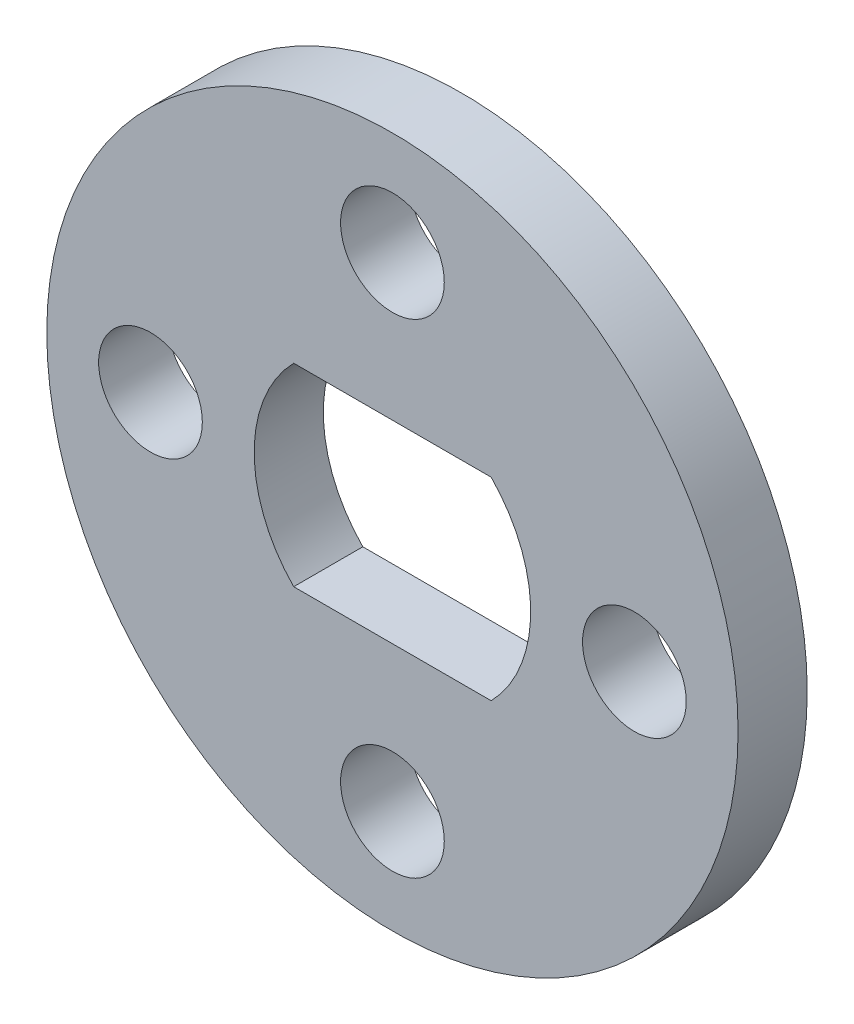
ISO-10303-21;
HEADER;
FILE_DESCRIPTION(('STEP AP214'),'2;1');
FILE_NAME('part.step','',(''),(''),'','','');
FILE_SCHEMA(('AUTOMOTIVE_DESIGN { 1 0 10303 214 1 1 1 1 }'));
ENDSEC;
DATA;
#1=APPLICATION_CONTEXT('core data for automotive mechanical design processes');
#2=APPLICATION_PROTOCOL_DEFINITION('international standard','automotive_design',2000,#1);
#3=PRODUCT_CONTEXT('',#1,'mechanical');
#4=PRODUCT('Part','Part','',(#3));
#5=PRODUCT_RELATED_PRODUCT_CATEGORY('part','',(#4));
#6=PRODUCT_DEFINITION_FORMATION('','',#4);
#7=PRODUCT_DEFINITION_CONTEXT('part definition',#1,'design');
#8=PRODUCT_DEFINITION('design','',#6,#7);
#9=PRODUCT_DEFINITION_SHAPE('','',#8);
#10=(LENGTH_UNIT() NAMED_UNIT(*) SI_UNIT(.MILLI.,.METRE.));
#11=(NAMED_UNIT(*) PLANE_ANGLE_UNIT() SI_UNIT($,.RADIAN.));
#12=(NAMED_UNIT(*) SI_UNIT($,.STERADIAN.) SOLID_ANGLE_UNIT());
#13=UNCERTAINTY_MEASURE_WITH_UNIT(LENGTH_MEASURE(1.E-05),#10,'distance_accuracy_value','');
#14=(GEOMETRIC_REPRESENTATION_CONTEXT(3) GLOBAL_UNCERTAINTY_ASSIGNED_CONTEXT((#13)) GLOBAL_UNIT_ASSIGNED_CONTEXT((#10,
#11,#12)) REPRESENTATION_CONTEXT('',''));
#15=CARTESIAN_POINT('',(0.,0.,0.));
#16=DIRECTION('',(0.,0.,1.));
#17=DIRECTION('',(1.,0.,0.));
#18=AXIS2_PLACEMENT_3D('',#15,#16,#17);
#19=CARTESIAN_POINT('',(0.,0.,2.));
#20=DIRECTION('',(0.,0.,1.));
#21=DIRECTION('',(1.,0.,0.));
#22=AXIS2_PLACEMENT_3D('',#19,#20,#21);
#23=PLANE('',#22);
#24=CARTESIAN_POINT('',(-7.,0.,2.));
#25=DIRECTION('',(0.,0.,1.));
#26=DIRECTION('',(1.,0.,0.));
#27=AXIS2_PLACEMENT_3D('',#24,#25,#26);
#28=CIRCLE('',#27,1.5);
#29=CARTESIAN_POINT('',(-5.5,0.,2.));
#30=VERTEX_POINT('',#29);
#31=EDGE_CURVE('E144',#30,#30,#28,.T.);
#32=ORIENTED_EDGE('',*,*,#31,.F.);
#33=EDGE_LOOP('',(#32));
#34=FACE_BOUND('',#33,.T.);
#35=CARTESIAN_POINT('',(0.,7.,2.));
#36=DIRECTION('',(0.,0.,1.));
#37=DIRECTION('',(1.,0.,0.));
#38=AXIS2_PLACEMENT_3D('',#35,#36,#37);
#39=CIRCLE('',#38,1.5);
#40=CARTESIAN_POINT('',(1.5,7.,2.));
#41=VERTEX_POINT('',#40);
#42=EDGE_CURVE('E160',#41,#41,#39,.T.);
#43=ORIENTED_EDGE('',*,*,#42,.F.);
#44=EDGE_LOOP('',(#43));
#45=FACE_BOUND('',#44,.T.);
#46=CARTESIAN_POINT('',(0.,0.,2.));
#47=DIRECTION('',(0.,0.,1.));
#48=DIRECTION('',(1.,0.,0.));
#49=AXIS2_PLACEMENT_3D('',#46,#47,#48);
#50=CIRCLE('',#49,10.);
#51=CARTESIAN_POINT('',(10.,0.,2.));
#52=VERTEX_POINT('',#51);
#53=EDGE_CURVE('E11',#52,#52,#50,.T.);
#54=ORIENTED_EDGE('',*,*,#53,.T.);
#55=EDGE_LOOP('',(#54));
#56=FACE_BOUND('',#55,.T.);
#57=CARTESIAN_POINT('',(7.,0.,2.));
#58=DIRECTION('',(0.,0.,1.));
#59=DIRECTION('',(1.,0.,0.));
#60=AXIS2_PLACEMENT_3D('',#57,#58,#59);
#61=CIRCLE('',#60,1.5);
#62=CARTESIAN_POINT('',(8.5,0.,2.));
#63=VERTEX_POINT('',#62);
#64=EDGE_CURVE('E152',#63,#63,#61,.T.);
#65=ORIENTED_EDGE('',*,*,#64,.F.);
#66=EDGE_LOOP('',(#65));
#67=FACE_BOUND('',#66,.T.);
#68=CARTESIAN_POINT('',(0.,-7.,2.));
#69=DIRECTION('',(0.,0.,1.));
#70=DIRECTION('',(1.,0.,0.));
#71=AXIS2_PLACEMENT_3D('',#68,#69,#70);
#72=CIRCLE('',#71,1.5);
#73=CARTESIAN_POINT('',(1.5,-7.,2.));
#74=VERTEX_POINT('',#73);
#75=EDGE_CURVE('E136',#74,#74,#72,.T.);
#76=ORIENTED_EDGE('',*,*,#75,.F.);
#77=EDGE_LOOP('',(#76));
#78=FACE_BOUND('',#77,.T.);
#79=DIRECTION('',(-1.,0.,0.));
#80=VECTOR('',#79,1.);
#81=CARTESIAN_POINT('',(0.,-2.8,2.));
#82=LINE('',#81,#80);
#83=CARTESIAN_POINT('',(2.85657137141714,-2.8,2.));
#84=VERTEX_POINT('',#83);
#85=CARTESIAN_POINT('',(-2.85657137141714,-2.8,2.));
#86=VERTEX_POINT('',#85);
#87=EDGE_CURVE('E103',#84,#86,#82,.T.);
#88=ORIENTED_EDGE('',*,*,#87,.T.);
#89=CARTESIAN_POINT('',(0.,0.,2.));
#90=DIRECTION('',(0.,0.,-1.));
#91=DIRECTION('',(-1.,0.,0.));
#92=AXIS2_PLACEMENT_3D('',#89,#90,#91);
#93=CIRCLE('',#92,4.);
#94=CARTESIAN_POINT('',(-2.85657137141714,2.8,2.));
#95=VERTEX_POINT('',#94);
#96=EDGE_CURVE('E98',#95,#86,#93,.F.);
#97=ORIENTED_EDGE('',*,*,#96,.F.);
#98=DIRECTION('',(-1.,0.,0.));
#99=VECTOR('',#98,1.);
#100=CARTESIAN_POINT('',(0.,2.8,2.));
#101=LINE('',#100,#99);
#102=CARTESIAN_POINT('',(2.85657137141714,2.8,2.));
#103=VERTEX_POINT('',#102);
#104=EDGE_CURVE('E89',#103,#95,#101,.T.);
#105=ORIENTED_EDGE('',*,*,#104,.F.);
#106=CARTESIAN_POINT('',(0.,0.,2.));
#107=DIRECTION('',(0.,0.,-1.));
#108=DIRECTION('',(-1.,0.,0.));
#109=AXIS2_PLACEMENT_3D('',#106,#107,#108);
#110=CIRCLE('',#109,4.);
#111=EDGE_CURVE('E63',#103,#84,#110,.T.);
#112=ORIENTED_EDGE('',*,*,#111,.T.);
#113=EDGE_LOOP('',(#88,#97,#105,#112));
#114=FACE_BOUND('',#113,.T.);
#115=ADVANCED_FACE('F47',(#34,#45,#56,#67,#78,#114),#23,.T.);
#116=CARTESIAN_POINT('',(0.,0.,0.));
#117=DIRECTION('',(0.,0.,1.));
#118=DIRECTION('',(1.,0.,0.));
#119=AXIS2_PLACEMENT_3D('',#116,#117,#118);
#120=PLANE('',#119);
#121=CARTESIAN_POINT('',(0.,-7.,0.));
#122=DIRECTION('',(0.,0.,1.));
#123=DIRECTION('',(1.,0.,0.));
#124=AXIS2_PLACEMENT_3D('',#121,#122,#123);
#125=CIRCLE('',#124,1.5);
#126=CARTESIAN_POINT('',(1.5,-7.,0.));
#127=VERTEX_POINT('',#126);
#128=EDGE_CURVE('E130',#127,#127,#125,.T.);
#129=ORIENTED_EDGE('',*,*,#128,.T.);
#130=EDGE_LOOP('',(#129));
#131=FACE_BOUND('',#130,.T.);
#132=CARTESIAN_POINT('',(-7.,0.,0.));
#133=DIRECTION('',(0.,0.,1.));
#134=DIRECTION('',(1.,0.,0.));
#135=AXIS2_PLACEMENT_3D('',#132,#133,#134);
#136=CIRCLE('',#135,1.5);
#137=CARTESIAN_POINT('',(-5.5,0.,0.));
#138=VERTEX_POINT('',#137);
#139=EDGE_CURVE('E140',#138,#138,#136,.T.);
#140=ORIENTED_EDGE('',*,*,#139,.T.);
#141=EDGE_LOOP('',(#140));
#142=FACE_BOUND('',#141,.T.);
#143=CARTESIAN_POINT('',(7.,0.,0.));
#144=DIRECTION('',(0.,0.,1.));
#145=DIRECTION('',(1.,0.,0.));
#146=AXIS2_PLACEMENT_3D('',#143,#144,#145);
#147=CIRCLE('',#146,1.5);
#148=CARTESIAN_POINT('',(8.5,0.,0.));
#149=VERTEX_POINT('',#148);
#150=EDGE_CURVE('E148',#149,#149,#147,.T.);
#151=ORIENTED_EDGE('',*,*,#150,.T.);
#152=EDGE_LOOP('',(#151));
#153=FACE_BOUND('',#152,.T.);
#154=CARTESIAN_POINT('',(0.,7.,0.));
#155=DIRECTION('',(0.,0.,1.));
#156=DIRECTION('',(1.,0.,0.));
#157=AXIS2_PLACEMENT_3D('',#154,#155,#156);
#158=CIRCLE('',#157,1.5);
#159=CARTESIAN_POINT('',(1.5,7.,0.));
#160=VERTEX_POINT('',#159);
#161=EDGE_CURVE('E156',#160,#160,#158,.T.);
#162=ORIENTED_EDGE('',*,*,#161,.T.);
#163=EDGE_LOOP('',(#162));
#164=FACE_BOUND('',#163,.T.);
#165=CARTESIAN_POINT('',(0.,0.,0.));
#166=DIRECTION('',(0.,0.,1.));
#167=DIRECTION('',(1.,0.,0.));
#168=AXIS2_PLACEMENT_3D('',#165,#166,#167);
#169=CIRCLE('',#168,10.);
#170=CARTESIAN_POINT('',(10.,0.,0.));
#171=VERTEX_POINT('',#170);
#172=EDGE_CURVE('E51',#171,#171,#169,.T.);
#173=ORIENTED_EDGE('',*,*,#172,.F.);
#174=EDGE_LOOP('',(#173));
#175=FACE_BOUND('',#174,.T.);
#176=CARTESIAN_POINT('',(0.,0.,0.));
#177=DIRECTION('',(0.,0.,-1.));
#178=DIRECTION('',(-1.,0.,0.));
#179=AXIS2_PLACEMENT_3D('',#176,#177,#178);
#180=CIRCLE('',#179,4.);
#181=CARTESIAN_POINT('',(-2.85657137141714,2.8,0.));
#182=VERTEX_POINT('',#181);
#183=CARTESIAN_POINT('',(-2.85657137141714,-2.8,0.));
#184=VERTEX_POINT('',#183);
#185=EDGE_CURVE('E71',#182,#184,#180,.F.);
#186=ORIENTED_EDGE('',*,*,#185,.T.);
#187=DIRECTION('',(-1.,0.,0.));
#188=VECTOR('',#187,1.);
#189=CARTESIAN_POINT('',(0.,-2.8,0.));
#190=LINE('',#189,#188);
#191=CARTESIAN_POINT('',(2.85657137141714,-2.8,0.));
#192=VERTEX_POINT('',#191);
#193=EDGE_CURVE('E108',#192,#184,#190,.T.);
#194=ORIENTED_EDGE('',*,*,#193,.F.);
#195=CARTESIAN_POINT('',(0.,0.,0.));
#196=DIRECTION('',(0.,0.,-1.));
#197=DIRECTION('',(-1.,0.,0.));
#198=AXIS2_PLACEMENT_3D('',#195,#196,#197);
#199=CIRCLE('',#198,4.);
#200=CARTESIAN_POINT('',(2.85657137141714,2.8,0.));
#201=VERTEX_POINT('',#200);
#202=EDGE_CURVE('E112',#201,#192,#199,.T.);
#203=ORIENTED_EDGE('',*,*,#202,.F.);
#204=DIRECTION('',(-1.,0.,0.));
#205=VECTOR('',#204,1.);
#206=CARTESIAN_POINT('',(0.,2.8,0.));
#207=LINE('',#206,#205);
#208=EDGE_CURVE('E121',#201,#182,#207,.T.);
#209=ORIENTED_EDGE('',*,*,#208,.T.);
#210=EDGE_LOOP('',(#186,#194,#203,#209));
#211=FACE_BOUND('',#210,.T.);
#212=ADVANCED_FACE('F168',(#131,#142,#153,#164,#175,#211),#120,.F.);
#213=CARTESIAN_POINT('',(0.,0.,2.));
#214=DIRECTION('',(0.,0.,-1.));
#215=DIRECTION('',(-1.,0.,0.));
#216=AXIS2_PLACEMENT_3D('',#213,#214,#215);
#217=CYLINDRICAL_SURFACE('',#216,10.);
#218=ORIENTED_EDGE('',*,*,#53,.F.);
#219=EDGE_LOOP('',(#218));
#220=FACE_BOUND('',#219,.T.);
#221=ORIENTED_EDGE('',*,*,#172,.T.);
#222=EDGE_LOOP('',(#221));
#223=FACE_BOUND('',#222,.T.);
#224=ADVANCED_FACE('F49',(#220,#223),#217,.T.);
#225=CARTESIAN_POINT('',(0.,7.,2.));
#226=DIRECTION('',(0.,0.,-1.));
#227=DIRECTION('',(-1.,0.,0.));
#228=AXIS2_PLACEMENT_3D('',#225,#226,#227);
#229=CYLINDRICAL_SURFACE('',#228,1.5);
#230=ORIENTED_EDGE('',*,*,#42,.T.);
#231=EDGE_LOOP('',(#230));
#232=FACE_BOUND('',#231,.T.);
#233=ORIENTED_EDGE('',*,*,#161,.F.);
#234=EDGE_LOOP('',(#233));
#235=FACE_BOUND('',#234,.T.);
#236=ADVANCED_FACE('F171',(#232,#235),#229,.F.);
#237=CARTESIAN_POINT('',(7.,0.,2.));
#238=DIRECTION('',(0.,0.,-1.));
#239=DIRECTION('',(-1.,0.,0.));
#240=AXIS2_PLACEMENT_3D('',#237,#238,#239);
#241=CYLINDRICAL_SURFACE('',#240,1.5);
#242=ORIENTED_EDGE('',*,*,#64,.T.);
#243=EDGE_LOOP('',(#242));
#244=FACE_BOUND('',#243,.T.);
#245=ORIENTED_EDGE('',*,*,#150,.F.);
#246=EDGE_LOOP('',(#245));
#247=FACE_BOUND('',#246,.T.);
#248=ADVANCED_FACE('F173',(#244,#247),#241,.F.);
#249=CARTESIAN_POINT('',(-7.,0.,2.));
#250=DIRECTION('',(0.,0.,-1.));
#251=DIRECTION('',(-1.,0.,0.));
#252=AXIS2_PLACEMENT_3D('',#249,#250,#251);
#253=CYLINDRICAL_SURFACE('',#252,1.5);
#254=ORIENTED_EDGE('',*,*,#31,.T.);
#255=EDGE_LOOP('',(#254));
#256=FACE_BOUND('',#255,.T.);
#257=ORIENTED_EDGE('',*,*,#139,.F.);
#258=EDGE_LOOP('',(#257));
#259=FACE_BOUND('',#258,.T.);
#260=ADVANCED_FACE('F179',(#256,#259),#253,.F.);
#261=CARTESIAN_POINT('',(0.,-7.,2.));
#262=DIRECTION('',(0.,0.,-1.));
#263=DIRECTION('',(-1.,0.,0.));
#264=AXIS2_PLACEMENT_3D('',#261,#262,#263);
#265=CYLINDRICAL_SURFACE('',#264,1.5);
#266=ORIENTED_EDGE('',*,*,#75,.T.);
#267=EDGE_LOOP('',(#266));
#268=FACE_BOUND('',#267,.T.);
#269=ORIENTED_EDGE('',*,*,#128,.F.);
#270=EDGE_LOOP('',(#269));
#271=FACE_BOUND('',#270,.T.);
#272=ADVANCED_FACE('F199',(#268,#271),#265,.F.);
#273=CARTESIAN_POINT('',(0.,0.,2.));
#274=DIRECTION('',(0.,0.,-1.));
#275=DIRECTION('',(-1.,0.,0.));
#276=AXIS2_PLACEMENT_3D('',#273,#274,#275);
#277=CYLINDRICAL_SURFACE('',#276,4.);
#278=ORIENTED_EDGE('',*,*,#185,.F.);
#279=DIRECTION('',(0.,0.,-1.));
#280=VECTOR('',#279,1.);
#281=CARTESIAN_POINT('',(-2.85657137141714,2.8,2.));
#282=LINE('',#281,#280);
#283=EDGE_CURVE('E92',#95,#182,#282,.T.);
#284=ORIENTED_EDGE('',*,*,#283,.F.);
#285=ORIENTED_EDGE('',*,*,#96,.T.);
#286=DIRECTION('',(0.,0.,-1.));
#287=VECTOR('',#286,1.);
#288=CARTESIAN_POINT('',(-2.85657137141714,-2.8,2.));
#289=LINE('',#288,#287);
#290=EDGE_CURVE('E127',#86,#184,#289,.T.);
#291=ORIENTED_EDGE('',*,*,#290,.T.);
#292=EDGE_LOOP('',(#278,#284,#285,#291));
#293=FACE_BOUND('',#292,.T.);
#294=ADVANCED_FACE('F100',(#293),#277,.F.);
#295=CARTESIAN_POINT('',(0.,-2.8,2.));
#296=DIRECTION('',(0.,-1.,0.));
#297=DIRECTION('',(0.,0.,-1.));
#298=AXIS2_PLACEMENT_3D('',#295,#296,#297);
#299=PLANE('',#298);
#300=ORIENTED_EDGE('',*,*,#193,.T.);
#301=ORIENTED_EDGE('',*,*,#290,.F.);
#302=ORIENTED_EDGE('',*,*,#87,.F.);
#303=DIRECTION('',(0.,0.,-1.));
#304=VECTOR('',#303,1.);
#305=CARTESIAN_POINT('',(2.85657137141714,-2.8,2.));
#306=LINE('',#305,#304);
#307=EDGE_CURVE('E131',#84,#192,#306,.T.);
#308=ORIENTED_EDGE('',*,*,#307,.T.);
#309=EDGE_LOOP('',(#300,#301,#302,#308));
#310=FACE_BOUND('',#309,.T.);
#311=ADVANCED_FACE('F217',(#310),#299,.F.);
#312=CARTESIAN_POINT('',(0.,0.,2.));
#313=DIRECTION('',(0.,0.,-1.));
#314=DIRECTION('',(-1.,0.,0.));
#315=AXIS2_PLACEMENT_3D('',#312,#313,#314);
#316=CYLINDRICAL_SURFACE('',#315,4.);
#317=ORIENTED_EDGE('',*,*,#202,.T.);
#318=ORIENTED_EDGE('',*,*,#307,.F.);
#319=ORIENTED_EDGE('',*,*,#111,.F.);
#320=DIRECTION('',(0.,0.,-1.));
#321=VECTOR('',#320,1.);
#322=CARTESIAN_POINT('',(2.85657137141714,2.8,2.));
#323=LINE('',#322,#321);
#324=EDGE_CURVE('E94',#103,#201,#323,.T.);
#325=ORIENTED_EDGE('',*,*,#324,.T.);
#326=EDGE_LOOP('',(#317,#318,#319,#325));
#327=FACE_BOUND('',#326,.T.);
#328=ADVANCED_FACE('F220',(#327),#316,.F.);
#329=CARTESIAN_POINT('',(0.,2.8,2.));
#330=DIRECTION('',(0.,-1.,0.));
#331=DIRECTION('',(0.,0.,-1.));
#332=AXIS2_PLACEMENT_3D('',#329,#330,#331);
#333=PLANE('',#332);
#334=ORIENTED_EDGE('',*,*,#208,.F.);
#335=ORIENTED_EDGE('',*,*,#324,.F.);
#336=ORIENTED_EDGE('',*,*,#104,.T.);
#337=ORIENTED_EDGE('',*,*,#283,.T.);
#338=EDGE_LOOP('',(#334,#335,#336,#337));
#339=FACE_BOUND('',#338,.T.);
#340=ADVANCED_FACE('F91',(#339),#333,.T.);
#341=CLOSED_SHELL('',(#115,#212,#224,#236,#248,#260,#272,#294,#311,#328,#340));
#342=MANIFOLD_SOLID_BREP('B2',#341);
#343=ADVANCED_BREP_SHAPE_REPRESENTATION('',(#18,#342),#14);
#344=SHAPE_DEFINITION_REPRESENTATION(#9,#343);
ENDSEC;
END-ISO-10303-21;
